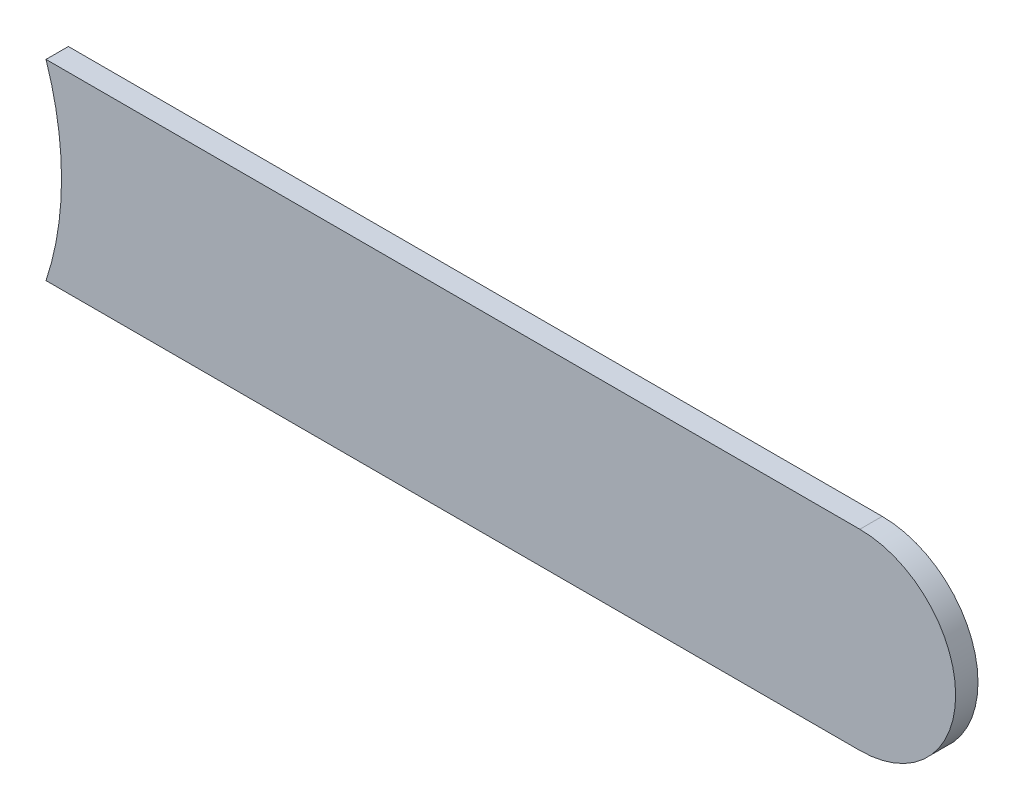
ISO-10303-21;
HEADER;
FILE_DESCRIPTION(('STEP AP214'),'2;1');
FILE_NAME('part.step','',(''),(''),'','','');
FILE_SCHEMA(('AUTOMOTIVE_DESIGN { 1 0 10303 214 1 1 1 1 }'));
ENDSEC;
DATA;
#1=APPLICATION_CONTEXT('core data for automotive mechanical design processes');
#2=APPLICATION_PROTOCOL_DEFINITION('international standard','automotive_design',2000,#1);
#3=PRODUCT_CONTEXT('',#1,'mechanical');
#4=PRODUCT('Part','Part','',(#3));
#5=PRODUCT_RELATED_PRODUCT_CATEGORY('part','',(#4));
#6=PRODUCT_DEFINITION_FORMATION('','',#4);
#7=PRODUCT_DEFINITION_CONTEXT('part definition',#1,'design');
#8=PRODUCT_DEFINITION('design','',#6,#7);
#9=PRODUCT_DEFINITION_SHAPE('','',#8);
#10=(LENGTH_UNIT() NAMED_UNIT(*) SI_UNIT(.MILLI.,.METRE.));
#11=(NAMED_UNIT(*) PLANE_ANGLE_UNIT() SI_UNIT($,.RADIAN.));
#12=(NAMED_UNIT(*) SI_UNIT($,.STERADIAN.) SOLID_ANGLE_UNIT());
#13=UNCERTAINTY_MEASURE_WITH_UNIT(LENGTH_MEASURE(1.E-05),#10,'distance_accuracy_value','');
#14=(GEOMETRIC_REPRESENTATION_CONTEXT(3) GLOBAL_UNCERTAINTY_ASSIGNED_CONTEXT((#13)) GLOBAL_UNIT_ASSIGNED_CONTEXT((#10,
#11,#12)) REPRESENTATION_CONTEXT('',''));
#15=CARTESIAN_POINT('',(0.,0.,0.));
#16=DIRECTION('',(0.,0.,1.));
#17=DIRECTION('',(1.,0.,0.));
#18=AXIS2_PLACEMENT_3D('',#15,#16,#17);
#19=CARTESIAN_POINT('',(155.61,-63.19,1.6));
#20=DIRECTION('',(0.,-1.,0.));
#21=DIRECTION('',(0.,0.,-1.));
#22=AXIS2_PLACEMENT_3D('',#19,#20,#21);
#23=PLANE('',#22);
#24=DIRECTION('',(0.,0.,-1.));
#25=VECTOR('',#24,1.);
#26=CARTESIAN_POINT('',(154.33569390943,-63.19,-0.045));
#27=LINE('',#26,#25);
#28=CARTESIAN_POINT('',(154.33569390943,-63.19,1.635));
#29=VERTEX_POINT('',#28);
#30=CARTESIAN_POINT('',(154.33569390943,-63.19,1.6));
#31=VERTEX_POINT('',#30);
#32=EDGE_CURVE('E11',#29,#31,#27,.T.);
#33=ORIENTED_EDGE('',*,*,#32,.F.);
#34=DIRECTION('',(-1.,0.,0.));
#35=VECTOR('',#34,1.);
#36=CARTESIAN_POINT('',(155.61,-63.19,1.635));
#37=LINE('',#36,#35);
#38=CARTESIAN_POINT('',(155.61,-63.19,1.635));
#39=VERTEX_POINT('',#38);
#40=EDGE_CURVE('E26',#39,#29,#37,.T.);
#41=ORIENTED_EDGE('',*,*,#40,.F.);
#42=DIRECTION('',(0.,0.,1.));
#43=VECTOR('',#42,1.);
#44=CARTESIAN_POINT('',(155.61,-63.19,1.6));
#45=LINE('',#44,#43);
#46=CARTESIAN_POINT('',(155.61,-63.19,1.6));
#47=VERTEX_POINT('',#46);
#48=EDGE_CURVE('E54',#47,#39,#45,.T.);
#49=ORIENTED_EDGE('',*,*,#48,.F.);
#50=DIRECTION('',(-1.,0.,0.));
#51=VECTOR('',#50,1.);
#52=CARTESIAN_POINT('',(155.61,-63.19,1.6));
#53=LINE('',#52,#51);
#54=EDGE_CURVE('E77',#47,#31,#53,.T.);
#55=ORIENTED_EDGE('',*,*,#54,.T.);
#56=EDGE_LOOP('',(#33,#41,#49,#55));
#57=FACE_BOUND('',#56,.T.);
#58=ADVANCED_FACE('F17',(#57),#23,.F.);
#59=CARTESIAN_POINT('',(153.885,-63.34,-0.045));
#60=DIRECTION('',(0.,0.,-1.));
#61=DIRECTION('',(0.,-1.,0.));
#62=AXIS2_PLACEMENT_3D('',#59,#60,#61);
#63=CYLINDRICAL_SURFACE('',#62,0.475);
#64=DIRECTION('',(0.,0.,-1.));
#65=VECTOR('',#64,1.);
#66=CARTESIAN_POINT('',(154.33569390943,-63.49,-0.045));
#67=LINE('',#66,#65);
#68=CARTESIAN_POINT('',(154.33569390943,-63.49,1.635));
#69=VERTEX_POINT('',#68);
#70=CARTESIAN_POINT('',(154.33569390943,-63.49,1.6));
#71=VERTEX_POINT('',#70);
#72=EDGE_CURVE('E89',#69,#71,#67,.T.);
#73=ORIENTED_EDGE('',*,*,#72,.F.);
#74=CARTESIAN_POINT('',(153.885,-63.34,1.635));
#75=DIRECTION('',(0.,0.,-1.));
#76=DIRECTION('',(0.,-1.,0.));
#77=AXIS2_PLACEMENT_3D('',#74,#75,#76);
#78=CIRCLE('',#77,0.475);
#79=EDGE_CURVE('E114',#29,#69,#78,.T.);
#80=ORIENTED_EDGE('',*,*,#79,.F.);
#81=ORIENTED_EDGE('',*,*,#32,.T.);
#82=CARTESIAN_POINT('',(153.885,-63.34,1.6));
#83=DIRECTION('',(0.,0.,-1.));
#84=DIRECTION('',(0.,-1.,0.));
#85=AXIS2_PLACEMENT_3D('',#82,#83,#84);
#86=CIRCLE('',#85,0.475);
#87=EDGE_CURVE('E81',#31,#71,#86,.T.);
#88=ORIENTED_EDGE('',*,*,#87,.T.);
#89=EDGE_LOOP('',(#73,#80,#81,#88));
#90=FACE_BOUND('',#89,.T.);
#91=ADVANCED_FACE('F122',(#90),#63,.F.);
#92=CARTESIAN_POINT('',(153.885,-63.49,1.635));
#93=DIRECTION('',(0.,0.,1.));
#94=DIRECTION('',(1.,0.,0.));
#95=AXIS2_PLACEMENT_3D('',#92,#93,#94);
#96=PLANE('',#95);
#97=ORIENTED_EDGE('',*,*,#79,.T.);
#98=DIRECTION('',(1.,0.,0.));
#99=VECTOR('',#98,1.);
#100=CARTESIAN_POINT('',(153.885,-63.49,1.635));
#101=LINE('',#100,#99);
#102=CARTESIAN_POINT('',(155.61,-63.49,1.635));
#103=VERTEX_POINT('',#102);
#104=EDGE_CURVE('E97',#69,#103,#101,.T.);
#105=ORIENTED_EDGE('',*,*,#104,.T.);
#106=CARTESIAN_POINT('',(155.61,-63.34,1.635));
#107=DIRECTION('',(0.,0.,1.));
#108=DIRECTION('',(1.894780628694E-13,-1.,0.));
#109=AXIS2_PLACEMENT_3D('',#106,#107,#108);
#110=CIRCLE('',#109,0.15);
#111=EDGE_CURVE('E94',#103,#39,#110,.T.);
#112=ORIENTED_EDGE('',*,*,#111,.T.);
#113=ORIENTED_EDGE('',*,*,#40,.T.);
#114=EDGE_LOOP('',(#97,#105,#112,#113));
#115=FACE_BOUND('',#114,.T.);
#116=ADVANCED_FACE('F121',(#115),#96,.T.);
#117=CARTESIAN_POINT('',(155.61,-63.34,1.6));
#118=DIRECTION('',(0.,0.,-1.));
#119=DIRECTION('',(1.894780628694E-13,-1.,0.));
#120=AXIS2_PLACEMENT_3D('',#117,#118,#119);
#121=CYLINDRICAL_SURFACE('',#120,0.15);
#122=CARTESIAN_POINT('',(155.61,-63.34,1.6));
#123=DIRECTION('',(0.,0.,1.));
#124=DIRECTION('',(1.894780628694E-13,-1.,0.));
#125=AXIS2_PLACEMENT_3D('',#122,#123,#124);
#126=CIRCLE('',#125,0.15);
#127=CARTESIAN_POINT('',(155.61,-63.49,1.6));
#128=VERTEX_POINT('',#127);
#129=EDGE_CURVE('E72',#128,#47,#126,.T.);
#130=ORIENTED_EDGE('',*,*,#129,.T.);
#131=ORIENTED_EDGE('',*,*,#48,.T.);
#132=ORIENTED_EDGE('',*,*,#111,.F.);
#133=DIRECTION('',(0.,0.,1.));
#134=VECTOR('',#133,1.);
#135=CARTESIAN_POINT('',(155.61,-63.49,1.6));
#136=LINE('',#135,#134);
#137=EDGE_CURVE('E87',#128,#103,#136,.T.);
#138=ORIENTED_EDGE('',*,*,#137,.F.);
#139=EDGE_LOOP('',(#130,#131,#132,#138));
#140=FACE_BOUND('',#139,.T.);
#141=ADVANCED_FACE('F92',(#140),#121,.T.);
#142=CARTESIAN_POINT('',(153.885,-63.49,1.6));
#143=DIRECTION('',(0.,0.,1.));
#144=DIRECTION('',(1.,0.,0.));
#145=AXIS2_PLACEMENT_3D('',#142,#143,#144);
#146=PLANE('',#145);
#147=ORIENTED_EDGE('',*,*,#54,.F.);
#148=ORIENTED_EDGE('',*,*,#129,.F.);
#149=DIRECTION('',(1.,0.,0.));
#150=VECTOR('',#149,1.);
#151=CARTESIAN_POINT('',(153.885,-63.49,1.6));
#152=LINE('',#151,#150);
#153=EDGE_CURVE('E75',#71,#128,#152,.T.);
#154=ORIENTED_EDGE('',*,*,#153,.F.);
#155=ORIENTED_EDGE('',*,*,#87,.F.);
#156=EDGE_LOOP('',(#147,#148,#154,#155));
#157=FACE_BOUND('',#156,.T.);
#158=ADVANCED_FACE('F74',(#157),#146,.F.);
#159=CARTESIAN_POINT('',(153.885,-63.49,1.6));
#160=DIRECTION('',(0.,1.,0.));
#161=DIRECTION('',(1.,0.,0.));
#162=AXIS2_PLACEMENT_3D('',#159,#160,#161);
#163=PLANE('',#162);
#164=ORIENTED_EDGE('',*,*,#137,.T.);
#165=ORIENTED_EDGE('',*,*,#104,.F.);
#166=ORIENTED_EDGE('',*,*,#72,.T.);
#167=ORIENTED_EDGE('',*,*,#153,.T.);
#168=EDGE_LOOP('',(#164,#165,#166,#167));
#169=FACE_BOUND('',#168,.T.);
#170=ADVANCED_FACE('F85',(#169),#163,.F.);
#171=CLOSED_SHELL('',(#58,#91,#116,#141,#158,#170));
#172=MANIFOLD_SOLID_BREP('B1',#171);
#173=ADVANCED_BREP_SHAPE_REPRESENTATION('',(#18,#172),#14);
#174=SHAPE_DEFINITION_REPRESENTATION(#9,#173);
ENDSEC;
END-ISO-10303-21;
